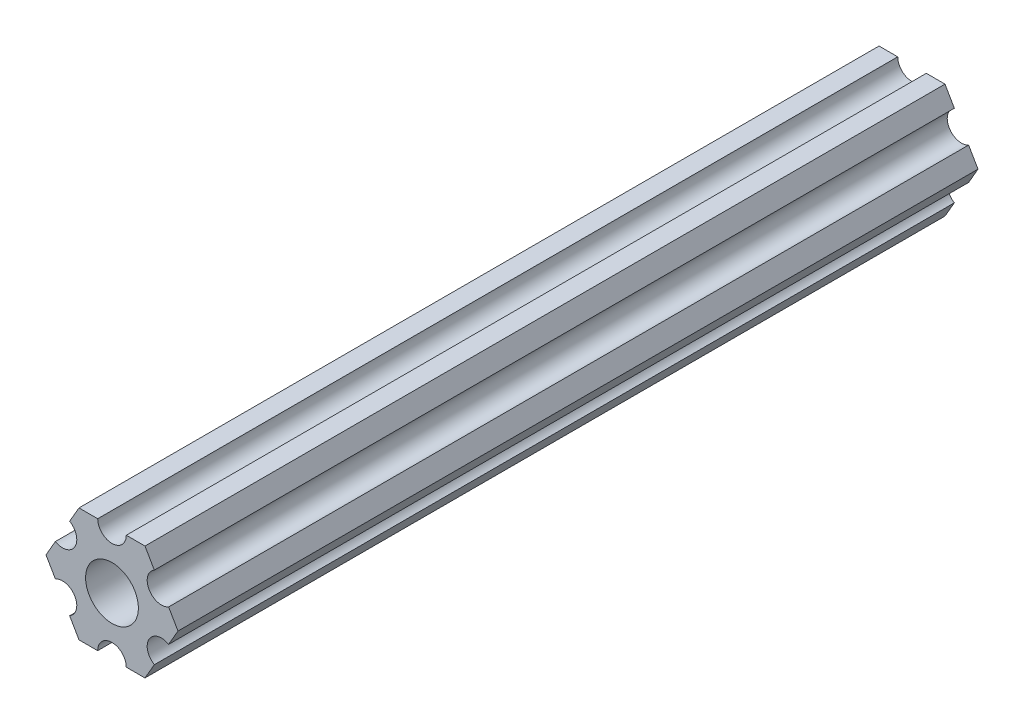
ISO-10303-21;
HEADER;
FILE_DESCRIPTION(('STEP AP214'),'2;1');
FILE_NAME('part.step','',(''),(''),'','','');
FILE_SCHEMA(('AUTOMOTIVE_DESIGN { 1 0 10303 214 1 1 1 1 }'));
ENDSEC;
DATA;
#1=APPLICATION_CONTEXT('core data for automotive mechanical design processes');
#2=APPLICATION_PROTOCOL_DEFINITION('international standard','automotive_design',2000,#1);
#3=PRODUCT_CONTEXT('',#1,'mechanical');
#4=PRODUCT('Part','Part','',(#3));
#5=PRODUCT_RELATED_PRODUCT_CATEGORY('part','',(#4));
#6=PRODUCT_DEFINITION_FORMATION('','',#4);
#7=PRODUCT_DEFINITION_CONTEXT('part definition',#1,'design');
#8=PRODUCT_DEFINITION('design','',#6,#7);
#9=PRODUCT_DEFINITION_SHAPE('','',#8);
#10=(LENGTH_UNIT() NAMED_UNIT(*) SI_UNIT(.MILLI.,.METRE.));
#11=(NAMED_UNIT(*) PLANE_ANGLE_UNIT() SI_UNIT($,.RADIAN.));
#12=(NAMED_UNIT(*) SI_UNIT($,.STERADIAN.) SOLID_ANGLE_UNIT());
#13=UNCERTAINTY_MEASURE_WITH_UNIT(LENGTH_MEASURE(1.E-05),#10,'distance_accuracy_value','');
#14=(GEOMETRIC_REPRESENTATION_CONTEXT(3) GLOBAL_UNCERTAINTY_ASSIGNED_CONTEXT((#13)) GLOBAL_UNIT_ASSIGNED_CONTEXT((#10,
#11,#12)) REPRESENTATION_CONTEXT('',''));
#15=CARTESIAN_POINT('',(0.,0.,0.));
#16=DIRECTION('',(0.,0.,1.));
#17=DIRECTION('',(1.,0.,0.));
#18=AXIS2_PLACEMENT_3D('',#15,#16,#17);
#19=CARTESIAN_POINT('',(6.29301142309098,-1.80018429024546,85.725));
#20=DIRECTION('',(-0.866025434075723,0.499999947533953,0.));
#21=DIRECTION('',(0.,0.,1.));
#22=AXIS2_PLACEMENT_3D('',#19,#20,#21);
#23=PLANE('',#22);
#24=DIRECTION('',(0.,0.,1.));
#25=VECTOR('',#24,1.);
#26=CARTESIAN_POINT('',(7.33234841870827,4.44212519169686E-07,85.725));
#27=LINE('',#26,#25);
#28=CARTESIAN_POINT('',(7.33234841870826,4.44212518961143E-07,0.));
#29=VERTEX_POINT('',#28);
#30=CARTESIAN_POINT('',(7.33234841870826,4.44212518961143E-07,88.9));
#31=VERTEX_POINT('',#30);
#32=EDGE_CURVE('E12',#29,#31,#27,.T.);
#33=ORIENTED_EDGE('',*,*,#32,.T.);
#34=DIRECTION('',(-0.499999947533953,-0.866025434075723,0.));
#35=VECTOR('',#34,1.);
#36=CARTESIAN_POINT('',(6.29301142309098,-1.80018429024546,88.9));
#37=LINE('',#36,#35);
#38=CARTESIAN_POINT('',(6.29301142309098,-1.80018429024546,88.9));
#39=VERTEX_POINT('',#38);
#40=EDGE_CURVE('E221',#31,#39,#37,.T.);
#41=ORIENTED_EDGE('',*,*,#40,.T.);
#42=DIRECTION('',(0.,0.,-1.));
#43=VECTOR('',#42,1.);
#44=CARTESIAN_POINT('',(6.29301142309098,-1.80018429024546,85.725));
#45=LINE('',#44,#43);
#46=CARTESIAN_POINT('',(6.29301142309098,-1.80018429024546,0.));
#47=VERTEX_POINT('',#46);
#48=EDGE_CURVE('E186',#39,#47,#45,.T.);
#49=ORIENTED_EDGE('',*,*,#48,.T.);
#50=DIRECTION('',(0.499999947533953,0.866025434075723,0.));
#51=VECTOR('',#50,1.);
#52=CARTESIAN_POINT('',(6.29301142309098,-1.80018429024546,0.));
#53=LINE('',#52,#51);
#54=EDGE_CURVE('E140',#47,#29,#53,.T.);
#55=ORIENTED_EDGE('',*,*,#54,.T.);
#56=EDGE_LOOP('',(#33,#41,#49,#55));
#57=FACE_BOUND('',#56,.T.);
#58=ADVANCED_FACE('F51',(#57),#23,.F.);
#59=CARTESIAN_POINT('',(7.33234841870827,4.44212519169686E-07,85.725));
#60=DIRECTION('',(-0.866025373493145,-0.500000052466057,0.));
#61=DIRECTION('',(-0.500000052466057,0.866025373493145,0.));
#62=AXIS2_PLACEMENT_3D('',#59,#60,#61);
#63=PLANE('',#62);
#64=DIRECTION('',(0.,0.,1.));
#65=VECTOR('',#64,1.);
#66=CARTESIAN_POINT('',(6.29301120497139,1.80018505273894,85.725));
#67=LINE('',#66,#65);
#68=CARTESIAN_POINT('',(6.29301120497139,1.80018505273894,0.));
#69=VERTEX_POINT('',#68);
#70=CARTESIAN_POINT('',(6.29301120497139,1.80018505273894,88.9));
#71=VERTEX_POINT('',#70);
#72=EDGE_CURVE('E61',#69,#71,#67,.T.);
#73=ORIENTED_EDGE('',*,*,#72,.T.);
#74=DIRECTION('',(0.500000052466055,-0.866025373493146,0.));
#75=VECTOR('',#74,1.);
#76=CARTESIAN_POINT('',(7.33234841870826,4.44212518961143E-07,88.9));
#77=LINE('',#76,#75);
#78=EDGE_CURVE('E217',#71,#31,#77,.T.);
#79=ORIENTED_EDGE('',*,*,#78,.T.);
#80=ORIENTED_EDGE('',*,*,#32,.F.);
#81=DIRECTION('',(-0.500000052466057,0.866025373493145,0.));
#82=VECTOR('',#81,1.);
#83=CARTESIAN_POINT('',(7.33234841870827,4.44212519198906E-07,0.));
#84=LINE('',#83,#82);
#85=EDGE_CURVE('E139',#29,#69,#84,.T.);
#86=ORIENTED_EDGE('',*,*,#85,.T.);
#87=EDGE_LOOP('',(#73,#79,#80,#86));
#88=FACE_BOUND('',#87,.T.);
#89=ADVANCED_FACE('F484',(#88),#63,.F.);
#90=CARTESIAN_POINT('',(4.70551103839172,4.54981561357972,85.725));
#91=DIRECTION('',(-0.866025373493151,-0.500000052466046,0.));
#92=DIRECTION('',(-0.500000052466046,0.866025373493151,0.));
#93=AXIS2_PLACEMENT_3D('',#90,#91,#92);
#94=PLANE('',#93);
#95=DIRECTION('',(0.,0.,1.));
#96=VECTOR('',#95,1.);
#97=CARTESIAN_POINT('',(3.66617382465481,6.35000022210627,85.725));
#98=LINE('',#97,#96);
#99=CARTESIAN_POINT('',(3.66617382465481,6.35000022210627,0.));
#100=VERTEX_POINT('',#99);
#101=CARTESIAN_POINT('',(3.66617382465481,6.35000022210627,88.9));
#102=VERTEX_POINT('',#101);
#103=EDGE_CURVE('E91',#100,#102,#98,.T.);
#104=ORIENTED_EDGE('',*,*,#103,.T.);
#105=DIRECTION('',(0.500000052466045,-0.866025373493151,0.));
#106=VECTOR('',#105,1.);
#107=CARTESIAN_POINT('',(4.70551103839172,4.54981561357972,88.9));
#108=LINE('',#107,#106);
#109=CARTESIAN_POINT('',(4.70551103839172,4.54981561357972,88.9));
#110=VERTEX_POINT('',#109);
#111=EDGE_CURVE('E227',#102,#110,#108,.T.);
#112=ORIENTED_EDGE('',*,*,#111,.T.);
#113=DIRECTION('',(0.,0.,1.));
#114=VECTOR('',#113,1.);
#115=CARTESIAN_POINT('',(4.70551103839172,4.54981561357972,85.725));
#116=LINE('',#115,#114);
#117=CARTESIAN_POINT('',(4.70551103839172,4.54981561357972,0.));
#118=VERTEX_POINT('',#117);
#119=EDGE_CURVE('E113',#118,#110,#116,.T.);
#120=ORIENTED_EDGE('',*,*,#119,.F.);
#121=DIRECTION('',(-0.500000052466046,0.866025373493151,0.));
#122=VECTOR('',#121,1.);
#123=CARTESIAN_POINT('',(4.70551103839172,4.54981561357972,0.));
#124=LINE('',#123,#122);
#125=EDGE_CURVE('E109',#118,#100,#124,.T.);
#126=ORIENTED_EDGE('',*,*,#125,.T.);
#127=EDGE_LOOP('',(#104,#112,#120,#126));
#128=FACE_BOUND('',#127,.T.);
#129=ADVANCED_FACE('F110',(#128),#94,.F.);
#130=CARTESIAN_POINT('',(3.66617382465481,6.35000022210627,85.725));
#131=DIRECTION('',(6.05825850611185E-08,-1.,0.));
#132=DIRECTION('',(0.,0.,-1.));
#133=AXIS2_PLACEMENT_3D('',#130,#131,#132);
#134=PLANE('',#133);
#135=DIRECTION('',(0.,0.,1.));
#136=VECTOR('',#135,1.);
#137=CARTESIAN_POINT('',(1.58749961530074,6.35000009617482,85.725));
#138=LINE('',#137,#136);
#139=CARTESIAN_POINT('',(1.58749961530073,6.35000015914054,0.));
#140=VERTEX_POINT('',#139);
#141=CARTESIAN_POINT('',(1.58749961530074,6.35,88.9));
#142=VERTEX_POINT('',#141);
#143=EDGE_CURVE('E105',#140,#142,#138,.T.);
#144=ORIENTED_EDGE('',*,*,#143,.T.);
#145=DIRECTION('',(1.,3.02912931564594E-08,0.));
#146=VECTOR('',#145,1.);
#147=CARTESIAN_POINT('',(3.66617382465481,6.35000022210627,88.9));
#148=LINE('',#147,#146);
#149=EDGE_CURVE('E100',#142,#102,#148,.T.);
#150=ORIENTED_EDGE('',*,*,#149,.T.);
#151=ORIENTED_EDGE('',*,*,#103,.F.);
#152=DIRECTION('',(-1.,0.,0.));
#153=VECTOR('',#152,1.);
#154=CARTESIAN_POINT('',(5.49926112168156,6.35000022210627,0.));
#155=LINE('',#154,#153);
#156=EDGE_CURVE('E96',#100,#140,#155,.T.);
#157=ORIENTED_EDGE('',*,*,#156,.T.);
#158=EDGE_LOOP('',(#144,#150,#151,#157));
#159=FACE_BOUND('',#158,.T.);
#160=ADVANCED_FACE('F94',(#159),#134,.F.);
#161=CARTESIAN_POINT('',(-3.84699260060323E-07,6.35,85.725));
#162=DIRECTION('',(0.,0.,-1.));
#163=DIRECTION('',(-1.,0.,0.));
#164=AXIS2_PLACEMENT_3D('',#161,#162,#163);
#165=CYLINDRICAL_SURFACE('',#164,1.5875);
#166=DIRECTION('',(0.,0.,1.));
#167=VECTOR('',#166,1.);
#168=CARTESIAN_POINT('',(-1.58750038469926,6.34999990382518,85.725));
#169=LINE('',#168,#167);
#170=CARTESIAN_POINT('',(-1.58750038469926,6.34999990382519,0.));
#171=VERTEX_POINT('',#170);
#172=CARTESIAN_POINT('',(-1.58750038469926,6.34999990382519,88.9));
#173=VERTEX_POINT('',#172);
#174=EDGE_CURVE('E175',#171,#173,#169,.T.);
#175=ORIENTED_EDGE('',*,*,#174,.T.);
#176=CARTESIAN_POINT('',(-3.84699260060323E-07,6.35,88.9));
#177=DIRECTION('',(0.,0.,1.));
#178=DIRECTION('',(1.,0.,0.));
#179=AXIS2_PLACEMENT_3D('',#176,#177,#178);
#180=CIRCLE('',#179,1.5875);
#181=EDGE_CURVE('E230',#173,#142,#180,.T.);
#182=ORIENTED_EDGE('',*,*,#181,.T.);
#183=ORIENTED_EDGE('',*,*,#143,.F.);
#184=CARTESIAN_POINT('',(-3.84699260060323E-07,6.35,0.));
#185=DIRECTION('',(0.,0.,-1.));
#186=DIRECTION('',(-1.,0.,0.));
#187=AXIS2_PLACEMENT_3D('',#184,#185,#186);
#188=CIRCLE('',#187,1.5875);
#189=EDGE_CURVE('E124',#140,#171,#188,.T.);
#190=ORIENTED_EDGE('',*,*,#189,.T.);
#191=EDGE_LOOP('',(#175,#182,#183,#190));
#192=FACE_BOUND('',#191,.T.);
#193=ADVANCED_FACE('F490',(#192),#165,.F.);
#194=CARTESIAN_POINT('',(-1.58750038469926,6.34999990382518,85.725));
#195=DIRECTION('',(6.05825963273174E-08,-1.,0.));
#196=DIRECTION('',(0.,0.,-1.));
#197=AXIS2_PLACEMENT_3D('',#194,#195,#196);
#198=PLANE('',#197);
#199=DIRECTION('',(0.,0.,1.));
#200=VECTOR('',#199,1.);
#201=CARTESIAN_POINT('',(-3.66617459405349,6.3499997778937,85.725));
#202=LINE('',#201,#200);
#203=CARTESIAN_POINT('',(-3.66617454558244,6.34999986184803,0.));
#204=VERTEX_POINT('',#203);
#205=CARTESIAN_POINT('',(-3.66617454558244,6.34999986184803,88.9));
#206=VERTEX_POINT('',#205);
#207=EDGE_CURVE('E171',#204,#206,#202,.T.);
#208=ORIENTED_EDGE('',*,*,#207,.T.);
#209=DIRECTION('',(1.,2.0194198968488E-08,0.));
#210=VECTOR('',#209,1.);
#211=CARTESIAN_POINT('',(-1.58750038469926,6.34999990382519,88.9));
#212=LINE('',#211,#210);
#213=EDGE_CURVE('E233',#206,#173,#212,.T.);
#214=ORIENTED_EDGE('',*,*,#213,.T.);
#215=ORIENTED_EDGE('',*,*,#174,.F.);
#216=DIRECTION('',(-1.,0.,0.));
#217=VECTOR('',#216,1.);
#218=CARTESIAN_POINT('',(5.49926112168156,6.34999990382519,0.));
#219=LINE('',#218,#217);
#220=EDGE_CURVE('E132',#171,#204,#219,.T.);
#221=ORIENTED_EDGE('',*,*,#220,.T.);
#222=EDGE_LOOP('',(#208,#214,#215,#221));
#223=FACE_BOUND('',#222,.T.);
#224=ADVANCED_FACE('F356',(#223),#198,.F.);
#225=CARTESIAN_POINT('',(-3.66617459405349,6.3499997778937,85.725));
#226=DIRECTION('',(0.866025434075729,-0.499999947533942,0.));
#227=DIRECTION('',(0.,0.,-1.));
#228=AXIS2_PLACEMENT_3D('',#225,#226,#227);
#229=PLANE('',#228);
#230=DIRECTION('',(0.,0.,1.));
#231=VECTOR('',#230,1.);
#232=CARTESIAN_POINT('',(-4.70551158967065,4.54981504343587,85.725));
#233=LINE('',#232,#231);
#234=CARTESIAN_POINT('',(-4.70551158967065,4.54981504343587,0.));
#235=VERTEX_POINT('',#234);
#236=CARTESIAN_POINT('',(-4.70551158967065,4.54981504343587,88.9));
#237=VERTEX_POINT('',#236);
#238=EDGE_CURVE('E170',#235,#237,#233,.T.);
#239=ORIENTED_EDGE('',*,*,#238,.T.);
#240=DIRECTION('',(0.499999947533939,0.866025434075731,0.));
#241=VECTOR('',#240,1.);
#242=CARTESIAN_POINT('',(-3.66617454558244,6.34999986184803,88.9));
#243=LINE('',#242,#241);
#244=EDGE_CURVE('E236',#237,#206,#243,.T.);
#245=ORIENTED_EDGE('',*,*,#244,.T.);
#246=ORIENTED_EDGE('',*,*,#207,.F.);
#247=DIRECTION('',(-0.499999947533943,-0.866025434075729,0.));
#248=VECTOR('',#247,1.);
#249=CARTESIAN_POINT('',(-3.66617459405349,6.3499997778937,0.));
#250=LINE('',#249,#248);
#251=EDGE_CURVE('E340',#204,#235,#250,.T.);
#252=ORIENTED_EDGE('',*,*,#251,.T.);
#253=EDGE_LOOP('',(#239,#245,#246,#252));
#254=FACE_BOUND('',#253,.T.);
#255=ADVANCED_FACE('F583',(#254),#229,.F.);
#256=CARTESIAN_POINT('',(-5.49926150638082,3.17499966684067,85.725));
#257=DIRECTION('',(0.,0.,-1.));
#258=DIRECTION('',(-1.,0.,0.));
#259=AXIS2_PLACEMENT_3D('',#256,#257,#258);
#260=CYLINDRICAL_SURFACE('',#259,1.5875);
#261=DIRECTION('',(0.,0.,1.));
#262=VECTOR('',#261,1.);
#263=CARTESIAN_POINT('',(-6.29301142309098,1.80018429024547,85.725));
#264=LINE('',#263,#262);
#265=CARTESIAN_POINT('',(-6.29301142309098,1.80018429024547,0.));
#266=VERTEX_POINT('',#265);
#267=CARTESIAN_POINT('',(-6.29301142309098,1.80018429024546,88.9));
#268=VERTEX_POINT('',#267);
#269=EDGE_CURVE('E148',#266,#268,#264,.T.);
#270=ORIENTED_EDGE('',*,*,#269,.T.);
#271=CARTESIAN_POINT('',(-5.49926150638082,3.17499966684067,88.9));
#272=DIRECTION('',(0.,0.,1.));
#273=DIRECTION('',(1.,0.,0.));
#274=AXIS2_PLACEMENT_3D('',#271,#272,#273);
#275=CIRCLE('',#274,1.5875);
#276=EDGE_CURVE('E239',#268,#237,#275,.T.);
#277=ORIENTED_EDGE('',*,*,#276,.T.);
#278=ORIENTED_EDGE('',*,*,#238,.F.);
#279=CARTESIAN_POINT('',(-5.49926150638082,3.17499966684067,0.));
#280=DIRECTION('',(0.,0.,-1.));
#281=DIRECTION('',(-1.,0.,0.));
#282=AXIS2_PLACEMENT_3D('',#279,#280,#281);
#283=CIRCLE('',#282,1.5875);
#284=EDGE_CURVE('E337',#235,#266,#283,.T.);
#285=ORIENTED_EDGE('',*,*,#284,.T.);
#286=EDGE_LOOP('',(#270,#277,#278,#285));
#287=FACE_BOUND('',#286,.T.);
#288=ADVANCED_FACE('F367',(#287),#260,.F.);
#289=CARTESIAN_POINT('',(-6.29301142309098,1.80018429024547,85.725));
#290=DIRECTION('',(0.866025434075724,-0.499999947533952,0.));
#291=DIRECTION('',(0.,0.,-1.));
#292=AXIS2_PLACEMENT_3D('',#289,#290,#291);
#293=PLANE('',#292);
#294=DIRECTION('',(0.,0.,1.));
#295=VECTOR('',#294,1.);
#296=CARTESIAN_POINT('',(-7.33234841870827,-4.44212523790841E-07,85.725));
#297=LINE('',#296,#295);
#298=CARTESIAN_POINT('',(-7.33234841870826,-4.44212524036367E-07,0.));
#299=VERTEX_POINT('',#298);
#300=CARTESIAN_POINT('',(-7.33234841870826,-4.44212524036367E-07,88.9));
#301=VERTEX_POINT('',#300);
#302=EDGE_CURVE('E144',#299,#301,#297,.T.);
#303=ORIENTED_EDGE('',*,*,#302,.T.);
#304=DIRECTION('',(0.499999947533951,0.866025434075724,0.));
#305=VECTOR('',#304,1.);
#306=CARTESIAN_POINT('',(-6.29301142309098,1.80018429024547,88.9));
#307=LINE('',#306,#305);
#308=EDGE_CURVE('E242',#301,#268,#307,.T.);
#309=ORIENTED_EDGE('',*,*,#308,.T.);
#310=ORIENTED_EDGE('',*,*,#269,.F.);
#311=DIRECTION('',(-0.499999947533952,-0.866025434075724,0.));
#312=VECTOR('',#311,1.);
#313=CARTESIAN_POINT('',(-6.29301142309098,1.80018429024547,0.));
#314=LINE('',#313,#312);
#315=EDGE_CURVE('E333',#266,#299,#314,.T.);
#316=ORIENTED_EDGE('',*,*,#315,.T.);
#317=EDGE_LOOP('',(#303,#309,#310,#316));
#318=FACE_BOUND('',#317,.T.);
#319=ADVANCED_FACE('F620',(#318),#293,.F.);
#320=CARTESIAN_POINT('',(-7.33234841870827,-4.44212523790841E-07,85.725));
#321=DIRECTION('',(0.866025373493151,0.500000052466045,0.));
#322=DIRECTION('',(0.,0.,-1.));
#323=AXIS2_PLACEMENT_3D('',#320,#321,#322);
#324=PLANE('',#323);
#325=DIRECTION('',(0.,0.,1.));
#326=VECTOR('',#325,1.);
#327=CARTESIAN_POINT('',(-6.29301120497141,-1.80018505273897,85.725));
#328=LINE('',#327,#326);
#329=CARTESIAN_POINT('',(-6.29301120497141,-1.80018505273897,0.));
#330=VERTEX_POINT('',#329);
#331=CARTESIAN_POINT('',(-6.29301120497141,-1.80018505273896,88.9));
#332=VERTEX_POINT('',#331);
#333=EDGE_CURVE('E149',#330,#332,#328,.T.);
#334=ORIENTED_EDGE('',*,*,#333,.T.);
#335=DIRECTION('',(-0.500000052466045,0.866025373493152,0.));
#336=VECTOR('',#335,1.);
#337=CARTESIAN_POINT('',(-7.33234841870826,-4.44212524036367E-07,88.9));
#338=LINE('',#337,#336);
#339=EDGE_CURVE('E245',#332,#301,#338,.T.);
#340=ORIENTED_EDGE('',*,*,#339,.T.);
#341=ORIENTED_EDGE('',*,*,#302,.F.);
#342=DIRECTION('',(0.500000052466045,-0.866025373493151,0.));
#343=VECTOR('',#342,1.);
#344=CARTESIAN_POINT('',(-7.33234841870827,-4.44212523969395E-07,0.));
#345=LINE('',#344,#343);
#346=EDGE_CURVE('E312',#299,#330,#345,.T.);
#347=ORIENTED_EDGE('',*,*,#346,.T.);
#348=EDGE_LOOP('',(#334,#340,#341,#347));
#349=FACE_BOUND('',#348,.T.);
#350=ADVANCED_FACE('F644',(#349),#324,.F.);
#351=CARTESIAN_POINT('',(-5.49926112168156,-3.17500033315934,85.725));
#352=DIRECTION('',(0.,0.,-1.));
#353=DIRECTION('',(-1.,0.,0.));
#354=AXIS2_PLACEMENT_3D('',#351,#352,#353);
#355=CYLINDRICAL_SURFACE('',#354,1.5875);
#356=DIRECTION('',(0.,0.,1.));
#357=VECTOR('',#356,1.);
#358=CARTESIAN_POINT('',(-4.70551103839172,-4.54981561357972,85.725));
#359=LINE('',#358,#357);
#360=CARTESIAN_POINT('',(-4.70551103839172,-4.54981561357972,0.));
#361=VERTEX_POINT('',#360);
#362=CARTESIAN_POINT('',(-4.70551103839172,-4.54981561357972,88.9));
#363=VERTEX_POINT('',#362);
#364=EDGE_CURVE('E163',#361,#363,#359,.T.);
#365=ORIENTED_EDGE('',*,*,#364,.T.);
#366=CARTESIAN_POINT('',(-5.49926112168156,-3.17500033315934,88.9));
#367=DIRECTION('',(0.,0.,1.));
#368=DIRECTION('',(1.,0.,0.));
#369=AXIS2_PLACEMENT_3D('',#366,#367,#368);
#370=CIRCLE('',#369,1.5875);
#371=EDGE_CURVE('E248',#363,#332,#370,.T.);
#372=ORIENTED_EDGE('',*,*,#371,.T.);
#373=ORIENTED_EDGE('',*,*,#333,.F.);
#374=CARTESIAN_POINT('',(-5.49926112168156,-3.17500033315934,0.));
#375=DIRECTION('',(0.,0.,-1.));
#376=DIRECTION('',(-1.,0.,0.));
#377=AXIS2_PLACEMENT_3D('',#374,#375,#376);
#378=CIRCLE('',#377,1.5875);
#379=EDGE_CURVE('E308',#330,#361,#378,.T.);
#380=ORIENTED_EDGE('',*,*,#379,.T.);
#381=EDGE_LOOP('',(#365,#372,#373,#380));
#382=FACE_BOUND('',#381,.T.);
#383=ADVANCED_FACE('F600',(#382),#355,.F.);
#384=CARTESIAN_POINT('',(-4.70551103839172,-4.54981561357972,85.725));
#385=DIRECTION('',(0.866025373493152,0.500000052466045,0.));
#386=DIRECTION('',(0.,0.,-1.));
#387=AXIS2_PLACEMENT_3D('',#384,#385,#386);
#388=PLANE('',#387);
#389=DIRECTION('',(0.,0.,1.));
#390=VECTOR('',#389,1.);
#391=CARTESIAN_POINT('',(-3.66617382465481,-6.35000022210628,85.725));
#392=LINE('',#391,#390);
#393=CARTESIAN_POINT('',(-3.66617382465481,-6.35000022210628,0.));
#394=VERTEX_POINT('',#393);
#395=CARTESIAN_POINT('',(-3.66617382465481,-6.35000022210628,88.9));
#396=VERTEX_POINT('',#395);
#397=EDGE_CURVE('E159',#394,#396,#392,.T.);
#398=ORIENTED_EDGE('',*,*,#397,.T.);
#399=DIRECTION('',(-0.500000052466043,0.866025373493153,0.));
#400=VECTOR('',#399,1.);
#401=CARTESIAN_POINT('',(-4.70551103839172,-4.54981561357972,88.9));
#402=LINE('',#401,#400);
#403=EDGE_CURVE('E251',#396,#363,#402,.T.);
#404=ORIENTED_EDGE('',*,*,#403,.T.);
#405=ORIENTED_EDGE('',*,*,#364,.F.);
#406=DIRECTION('',(0.500000052466045,-0.866025373493151,0.));
#407=VECTOR('',#406,1.);
#408=CARTESIAN_POINT('',(-4.70551103839172,-4.54981561357972,0.));
#409=LINE('',#408,#407);
#410=EDGE_CURVE('E313',#361,#394,#409,.T.);
#411=ORIENTED_EDGE('',*,*,#410,.T.);
#412=EDGE_LOOP('',(#398,#404,#405,#411));
#413=FACE_BOUND('',#412,.T.);
#414=ADVANCED_FACE('F595',(#413),#388,.F.);
#415=CARTESIAN_POINT('',(-3.66617382465481,-6.35000022210628,85.725));
#416=DIRECTION('',(-6.05825854783851E-08,1.,0.));
#417=DIRECTION('',(0.,0.,1.));
#418=AXIS2_PLACEMENT_3D('',#415,#416,#417);
#419=PLANE('',#418);
#420=DIRECTION('',(0.,0.,1.));
#421=VECTOR('',#420,1.);
#422=CARTESIAN_POINT('',(-1.58749961530074,-6.35,85.725));
#423=LINE('',#422,#421);
#424=CARTESIAN_POINT('',(-1.58749961530073,-6.35000011105314,0.));
#425=VERTEX_POINT('',#424);
#426=CARTESIAN_POINT('',(-1.58749961530073,-6.35000011105314,88.9));
#427=VERTEX_POINT('',#426);
#428=EDGE_CURVE('E158',#425,#427,#423,.T.);
#429=ORIENTED_EDGE('',*,*,#428,.T.);
#430=DIRECTION('',(-0.999999999999999,-5.34249856349037E-08,0.));
#431=VECTOR('',#430,1.);
#432=CARTESIAN_POINT('',(-3.66617382465481,-6.35000022210628,88.9));
#433=LINE('',#432,#431);
#434=EDGE_CURVE('E254',#427,#396,#433,.T.);
#435=ORIENTED_EDGE('',*,*,#434,.T.);
#436=ORIENTED_EDGE('',*,*,#397,.F.);
#437=DIRECTION('',(1.,0.,0.));
#438=VECTOR('',#437,1.);
#439=CARTESIAN_POINT('',(5.49926112168156,-6.35000022210628,0.));
#440=LINE('',#439,#438);
#441=EDGE_CURVE('E323',#394,#425,#440,.T.);
#442=ORIENTED_EDGE('',*,*,#441,.T.);
#443=EDGE_LOOP('',(#429,#435,#436,#442));
#444=FACE_BOUND('',#443,.T.);
#445=ADVANCED_FACE('F599',(#444),#419,.F.);
#446=CARTESIAN_POINT('',(3.8469926204343E-07,-6.35,85.725));
#447=DIRECTION('',(0.,0.,-1.));
#448=DIRECTION('',(-1.,0.,0.));
#449=AXIS2_PLACEMENT_3D('',#446,#447,#448);
#450=CYLINDRICAL_SURFACE('',#449,1.5875);
#451=DIRECTION('',(0.,0.,1.));
#452=VECTOR('',#451,1.);
#453=CARTESIAN_POINT('',(1.58750038469926,-6.34999990382518,85.725));
#454=LINE('',#453,#452);
#455=CARTESIAN_POINT('',(1.58750038469926,-6.34999990382519,0.));
#456=VERTEX_POINT('',#455);
#457=CARTESIAN_POINT('',(1.58750038469926,-6.34999990382519,88.9));
#458=VERTEX_POINT('',#457);
#459=EDGE_CURVE('E154',#456,#458,#454,.T.);
#460=ORIENTED_EDGE('',*,*,#459,.T.);
#461=CARTESIAN_POINT('',(3.8469926204343E-07,-6.35,88.9));
#462=DIRECTION('',(0.,0.,1.));
#463=DIRECTION('',(1.,0.,0.));
#464=AXIS2_PLACEMENT_3D('',#461,#462,#463);
#465=CIRCLE('',#464,1.5875);
#466=EDGE_CURVE('E257',#458,#427,#465,.T.);
#467=ORIENTED_EDGE('',*,*,#466,.T.);
#468=ORIENTED_EDGE('',*,*,#428,.F.);
#469=CARTESIAN_POINT('',(3.8469926204343E-07,-6.35,0.));
#470=DIRECTION('',(0.,0.,-1.));
#471=DIRECTION('',(-1.,0.,0.));
#472=AXIS2_PLACEMENT_3D('',#469,#470,#471);
#473=CIRCLE('',#472,1.5875);
#474=EDGE_CURVE('E285',#425,#456,#473,.T.);
#475=ORIENTED_EDGE('',*,*,#474,.T.);
#476=EDGE_LOOP('',(#460,#467,#468,#475));
#477=FACE_BOUND('',#476,.T.);
#478=ADVANCED_FACE('F611',(#477),#450,.F.);
#479=CARTESIAN_POINT('',(1.58750038469926,-6.34999990382518,85.725));
#480=DIRECTION('',(-6.05825721258438E-08,1.,0.));
#481=DIRECTION('',(0.,0.,1.));
#482=AXIS2_PLACEMENT_3D('',#479,#480,#481);
#483=PLANE('',#482);
#484=DIRECTION('',(0.,0.,1.));
#485=VECTOR('',#484,1.);
#486=CARTESIAN_POINT('',(3.66617459405346,-6.34999977789375,85.725));
#487=LINE('',#486,#485);
#488=CARTESIAN_POINT('',(3.66617454558244,-6.34999986184804,0.));
#489=VERTEX_POINT('',#488);
#490=CARTESIAN_POINT('',(3.66617454558244,-6.34999986184804,88.9));
#491=VERTEX_POINT('',#490);
#492=EDGE_CURVE('E153',#489,#491,#487,.T.);
#493=ORIENTED_EDGE('',*,*,#492,.T.);
#494=DIRECTION('',(-1.,-2.01941943785532E-08,0.));
#495=VECTOR('',#494,1.);
#496=CARTESIAN_POINT('',(1.58750038469926,-6.34999990382519,88.9));
#497=LINE('',#496,#495);
#498=EDGE_CURVE('E260',#491,#458,#497,.T.);
#499=ORIENTED_EDGE('',*,*,#498,.T.);
#500=ORIENTED_EDGE('',*,*,#459,.F.);
#501=DIRECTION('',(1.,0.,0.));
#502=VECTOR('',#501,1.);
#503=CARTESIAN_POINT('',(5.49926112168156,-6.34999990382519,0.));
#504=LINE('',#503,#502);
#505=EDGE_CURVE('E282',#456,#489,#504,.T.);
#506=ORIENTED_EDGE('',*,*,#505,.T.);
#507=EDGE_LOOP('',(#493,#499,#500,#506));
#508=FACE_BOUND('',#507,.T.);
#509=ADVANCED_FACE('F606',(#508),#483,.F.);
#510=CARTESIAN_POINT('',(3.66617459405346,-6.34999977789375,85.725));
#511=DIRECTION('',(-0.86602543407573,0.499999947533941,0.));
#512=DIRECTION('',(0.,0.,1.));
#513=AXIS2_PLACEMENT_3D('',#510,#511,#512);
#514=PLANE('',#513);
#515=DIRECTION('',(0.,0.,-1.));
#516=VECTOR('',#515,1.);
#517=CARTESIAN_POINT('',(4.70551158967065,-4.54981504343587,85.725));
#518=LINE('',#517,#516);
#519=CARTESIAN_POINT('',(4.70551158967065,-4.54981504343587,88.9));
#520=VERTEX_POINT('',#519);
#521=CARTESIAN_POINT('',(4.70551158967065,-4.54981504343587,0.));
#522=VERTEX_POINT('',#521);
#523=EDGE_CURVE('E143',#520,#522,#518,.T.);
#524=ORIENTED_EDGE('',*,*,#523,.F.);
#525=DIRECTION('',(-0.499999947533941,-0.86602543407573,0.));
#526=VECTOR('',#525,1.);
#527=CARTESIAN_POINT('',(3.66617454558244,-6.34999986184804,88.9));
#528=LINE('',#527,#526);
#529=EDGE_CURVE('E263',#520,#491,#528,.T.);
#530=ORIENTED_EDGE('',*,*,#529,.T.);
#531=ORIENTED_EDGE('',*,*,#492,.F.);
#532=DIRECTION('',(0.49999994753394,0.86602543407573,0.));
#533=VECTOR('',#532,1.);
#534=CARTESIAN_POINT('',(3.66617459405346,-6.34999977789376,0.));
#535=LINE('',#534,#533);
#536=EDGE_CURVE('E276',#489,#522,#535,.T.);
#537=ORIENTED_EDGE('',*,*,#536,.T.);
#538=EDGE_LOOP('',(#524,#530,#531,#537));
#539=FACE_BOUND('',#538,.T.);
#540=ADVANCED_FACE('F610',(#539),#514,.F.);
#541=CARTESIAN_POINT('',(5.49926112168156,3.17500033315934,0.));
#542=DIRECTION('',(0.,0.,1.));
#543=DIRECTION('',(1.,0.,0.));
#544=AXIS2_PLACEMENT_3D('',#541,#542,#543);
#545=PLANE('',#544);
#546=CARTESIAN_POINT('',(0.,0.,0.));
#547=DIRECTION('',(0.,0.,1.));
#548=DIRECTION('',(-1.,0.,0.));
#549=AXIS2_PLACEMENT_3D('',#546,#547,#548);
#550=CIRCLE('',#549,2.9337);
#551=CARTESIAN_POINT('',(-2.9337,0.,0.));
#552=VERTEX_POINT('',#551);
#553=CARTESIAN_POINT('',(2.9337,0.,0.));
#554=VERTEX_POINT('',#553);
#555=EDGE_CURVE('E200',#552,#554,#550,.T.);
#556=ORIENTED_EDGE('',*,*,#555,.T.);
#557=CARTESIAN_POINT('',(0.,0.,0.));
#558=DIRECTION('',(0.,0.,1.));
#559=DIRECTION('',(-1.,0.,0.));
#560=AXIS2_PLACEMENT_3D('',#557,#558,#559);
#561=CIRCLE('',#560,2.9337);
#562=EDGE_CURVE('E277',#554,#552,#561,.T.);
#563=ORIENTED_EDGE('',*,*,#562,.T.);
#564=EDGE_LOOP('',(#556,#563));
#565=FACE_BOUND('',#564,.T.);
#566=CARTESIAN_POINT('',(5.49926150638082,-3.17499966684067,0.));
#567=DIRECTION('',(0.,0.,-1.));
#568=DIRECTION('',(-1.,0.,0.));
#569=AXIS2_PLACEMENT_3D('',#566,#567,#568);
#570=CIRCLE('',#569,1.5875);
#571=CARTESIAN_POINT('',(3.91176150638082,-3.17499966684067,0.));
#572=VERTEX_POINT('',#571);
#573=EDGE_CURVE('E274',#522,#572,#570,.T.);
#574=ORIENTED_EDGE('',*,*,#573,.F.);
#575=ORIENTED_EDGE('',*,*,#536,.F.);
#576=ORIENTED_EDGE('',*,*,#505,.F.);
#577=ORIENTED_EDGE('',*,*,#474,.F.);
#578=ORIENTED_EDGE('',*,*,#441,.F.);
#579=ORIENTED_EDGE('',*,*,#410,.F.);
#580=ORIENTED_EDGE('',*,*,#379,.F.);
#581=ORIENTED_EDGE('',*,*,#346,.F.);
#582=ORIENTED_EDGE('',*,*,#315,.F.);
#583=ORIENTED_EDGE('',*,*,#284,.F.);
#584=ORIENTED_EDGE('',*,*,#251,.F.);
#585=ORIENTED_EDGE('',*,*,#220,.F.);
#586=ORIENTED_EDGE('',*,*,#189,.F.);
#587=ORIENTED_EDGE('',*,*,#156,.F.);
#588=ORIENTED_EDGE('',*,*,#125,.F.);
#589=CARTESIAN_POINT('',(5.49926112168156,3.17500033315934,0.));
#590=DIRECTION('',(0.,0.,-1.));
#591=DIRECTION('',(-1.,0.,0.));
#592=AXIS2_PLACEMENT_3D('',#589,#590,#591);
#593=CIRCLE('',#592,1.5875);
#594=CARTESIAN_POINT('',(3.91176112168156,3.17500033315934,0.));
#595=VERTEX_POINT('',#594);
#596=EDGE_CURVE('E185',#595,#118,#593,.T.);
#597=ORIENTED_EDGE('',*,*,#596,.F.);
#598=CARTESIAN_POINT('',(5.49926112168156,3.17500033315934,0.));
#599=DIRECTION('',(0.,0.,-1.));
#600=DIRECTION('',(-1.,0.,0.));
#601=AXIS2_PLACEMENT_3D('',#598,#599,#600);
#602=CIRCLE('',#601,1.5875);
#603=EDGE_CURVE('E118',#69,#595,#602,.T.);
#604=ORIENTED_EDGE('',*,*,#603,.F.);
#605=ORIENTED_EDGE('',*,*,#85,.F.);
#606=ORIENTED_EDGE('',*,*,#54,.F.);
#607=CARTESIAN_POINT('',(5.49926150638082,-3.17499966684067,0.));
#608=DIRECTION('',(0.,0.,-1.));
#609=DIRECTION('',(-1.,0.,0.));
#610=AXIS2_PLACEMENT_3D('',#607,#608,#609);
#611=CIRCLE('',#610,1.5875);
#612=EDGE_CURVE('E193',#572,#47,#611,.T.);
#613=ORIENTED_EDGE('',*,*,#612,.F.);
#614=EDGE_LOOP('',(#574,#575,#576,#577,#578,#579,#580,#581,#582,#583,#584,#585,#586,#587,#588,
#597,#604,#605,#606,#613));
#615=FACE_BOUND('',#614,.T.);
#616=ADVANCED_FACE('F121',(#565,#615),#545,.F.);
#617=CARTESIAN_POINT('',(5.49926112168156,3.17500033315934,85.725));
#618=DIRECTION('',(0.,0.,-1.));
#619=DIRECTION('',(-1.,0.,0.));
#620=AXIS2_PLACEMENT_3D('',#617,#618,#619);
#621=CYLINDRICAL_SURFACE('',#620,1.5875);
#622=ORIENTED_EDGE('',*,*,#119,.T.);
#623=CARTESIAN_POINT('',(5.49926112168156,3.17500033315934,88.9));
#624=DIRECTION('',(0.,0.,1.));
#625=DIRECTION('',(1.,0.,0.));
#626=AXIS2_PLACEMENT_3D('',#623,#624,#625);
#627=CIRCLE('',#626,1.5875);
#628=EDGE_CURVE('E224',#110,#71,#627,.T.);
#629=ORIENTED_EDGE('',*,*,#628,.T.);
#630=ORIENTED_EDGE('',*,*,#72,.F.);
#631=ORIENTED_EDGE('',*,*,#603,.T.);
#632=DIRECTION('',(0.,0.,-1.));
#633=VECTOR('',#632,1.);
#634=CARTESIAN_POINT('',(3.91176112168156,3.17500033315934,85.725));
#635=LINE('',#634,#633);
#636=CARTESIAN_POINT('',(3.91176112168156,3.17500033315934,85.725));
#637=VERTEX_POINT('',#636);
#638=EDGE_CURVE('E181',#637,#595,#635,.T.);
#639=ORIENTED_EDGE('',*,*,#638,.F.);
#640=ORIENTED_EDGE('',*,*,#638,.T.);
#641=ORIENTED_EDGE('',*,*,#596,.T.);
#642=EDGE_LOOP('',(#622,#629,#630,#631,#639,#640,#641));
#643=FACE_BOUND('',#642,.T.);
#644=ADVANCED_FACE('F487',(#643),#621,.F.);
#645=CARTESIAN_POINT('',(5.49926150638082,-3.17499966684067,85.725));
#646=DIRECTION('',(0.,0.,-1.));
#647=DIRECTION('',(-1.,0.,0.));
#648=AXIS2_PLACEMENT_3D('',#645,#646,#647);
#649=CYLINDRICAL_SURFACE('',#648,1.5875);
#650=ORIENTED_EDGE('',*,*,#48,.F.);
#651=CARTESIAN_POINT('',(5.49926150638082,-3.17499966684067,88.9));
#652=DIRECTION('',(0.,0.,1.));
#653=DIRECTION('',(1.,0.,0.));
#654=AXIS2_PLACEMENT_3D('',#651,#652,#653);
#655=CIRCLE('',#654,1.5875);
#656=EDGE_CURVE('E266',#39,#520,#655,.T.);
#657=ORIENTED_EDGE('',*,*,#656,.T.);
#658=ORIENTED_EDGE('',*,*,#523,.T.);
#659=ORIENTED_EDGE('',*,*,#573,.T.);
#660=DIRECTION('',(0.,0.,-1.));
#661=VECTOR('',#660,1.);
#662=CARTESIAN_POINT('',(3.91176150638082,-3.17499966684067,85.725));
#663=LINE('',#662,#661);
#664=CARTESIAN_POINT('',(3.91176150638082,-3.17499966684067,85.725));
#665=VERTEX_POINT('',#664);
#666=EDGE_CURVE('E189',#665,#572,#663,.T.);
#667=ORIENTED_EDGE('',*,*,#666,.F.);
#668=ORIENTED_EDGE('',*,*,#666,.T.);
#669=ORIENTED_EDGE('',*,*,#612,.T.);
#670=EDGE_LOOP('',(#650,#657,#658,#659,#667,#668,#669));
#671=FACE_BOUND('',#670,.T.);
#672=ADVANCED_FACE('F676',(#671),#649,.F.);
#673=CARTESIAN_POINT('',(0.,0.,85.725));
#674=DIRECTION('',(0.,0.,-1.));
#675=DIRECTION('',(-1.,0.,0.));
#676=AXIS2_PLACEMENT_3D('',#673,#674,#675);
#677=CYLINDRICAL_SURFACE('',#676,2.9337);
#678=DIRECTION('',(0.,0.,-1.));
#679=VECTOR('',#678,1.);
#680=CARTESIAN_POINT('',(-2.9337,0.,85.725));
#681=LINE('',#680,#679);
#682=CARTESIAN_POINT('',(-2.9337,0.,85.725));
#683=VERTEX_POINT('',#682);
#684=EDGE_CURVE('E194',#683,#552,#681,.T.);
#685=ORIENTED_EDGE('',*,*,#684,.F.);
#686=ORIENTED_EDGE('',*,*,#684,.T.);
#687=ORIENTED_EDGE('',*,*,#562,.F.);
#688=DIRECTION('',(0.,0.,-1.));
#689=VECTOR('',#688,1.);
#690=CARTESIAN_POINT('',(2.9337,0.,85.725));
#691=LINE('',#690,#689);
#692=CARTESIAN_POINT('',(2.9337,0.,85.725));
#693=VERTEX_POINT('',#692);
#694=EDGE_CURVE('E202',#693,#554,#691,.T.);
#695=ORIENTED_EDGE('',*,*,#694,.F.);
#696=ORIENTED_EDGE('',*,*,#694,.T.);
#697=ORIENTED_EDGE('',*,*,#555,.F.);
#698=EDGE_LOOP('',(#685,#686,#687,#695,#696,#697));
#699=FACE_BOUND('',#698,.T.);
#700=CARTESIAN_POINT('',(0.,0.,88.9));
#701=DIRECTION('',(0.,0.,1.));
#702=DIRECTION('',(1.,0.,0.));
#703=AXIS2_PLACEMENT_3D('',#700,#701,#702);
#704=CIRCLE('',#703,2.9337);
#705=CARTESIAN_POINT('',(2.9337,0.,88.9));
#706=VERTEX_POINT('',#705);
#707=EDGE_CURVE('E205',#706,#706,#704,.F.);
#708=ORIENTED_EDGE('',*,*,#707,.F.);
#709=EDGE_LOOP('',(#708));
#710=FACE_BOUND('',#709,.T.);
#711=ADVANCED_FACE('F684',(#699,#710),#677,.F.);
#712=CARTESIAN_POINT('',(5.49926112168156,3.17500033315934,88.9));
#713=DIRECTION('',(0.,0.,1.));
#714=DIRECTION('',(1.,0.,0.));
#715=AXIS2_PLACEMENT_3D('',#712,#713,#714);
#716=PLANE('',#715);
#717=ORIENTED_EDGE('',*,*,#628,.F.);
#718=ORIENTED_EDGE('',*,*,#111,.F.);
#719=ORIENTED_EDGE('',*,*,#149,.F.);
#720=ORIENTED_EDGE('',*,*,#181,.F.);
#721=ORIENTED_EDGE('',*,*,#213,.F.);
#722=ORIENTED_EDGE('',*,*,#244,.F.);
#723=ORIENTED_EDGE('',*,*,#276,.F.);
#724=ORIENTED_EDGE('',*,*,#308,.F.);
#725=ORIENTED_EDGE('',*,*,#339,.F.);
#726=ORIENTED_EDGE('',*,*,#371,.F.);
#727=ORIENTED_EDGE('',*,*,#403,.F.);
#728=ORIENTED_EDGE('',*,*,#434,.F.);
#729=ORIENTED_EDGE('',*,*,#466,.F.);
#730=ORIENTED_EDGE('',*,*,#498,.F.);
#731=ORIENTED_EDGE('',*,*,#529,.F.);
#732=ORIENTED_EDGE('',*,*,#656,.F.);
#733=ORIENTED_EDGE('',*,*,#40,.F.);
#734=ORIENTED_EDGE('',*,*,#78,.F.);
#735=EDGE_LOOP('',(#717,#718,#719,#720,#721,#722,#723,#724,#725,#726,#727,#728,#729,#730,#731,
#732,#733,#734));
#736=FACE_BOUND('',#735,.T.);
#737=ORIENTED_EDGE('',*,*,#707,.T.);
#738=EDGE_LOOP('',(#737));
#739=FACE_BOUND('',#738,.T.);
#740=ADVANCED_FACE('F482',(#736,#739),#716,.T.);
#741=CLOSED_SHELL('',(#58,#89,#129,#160,#193,#224,#255,#288,#319,#350,#383,#414,#445,#478,#509,
#540,#616,#644,#672,#711,#740));
#742=MANIFOLD_SOLID_BREP('B2',#741);
#743=ADVANCED_BREP_SHAPE_REPRESENTATION('',(#18,#742),#14);
#744=SHAPE_DEFINITION_REPRESENTATION(#9,#743);
ENDSEC;
END-ISO-10303-21;
